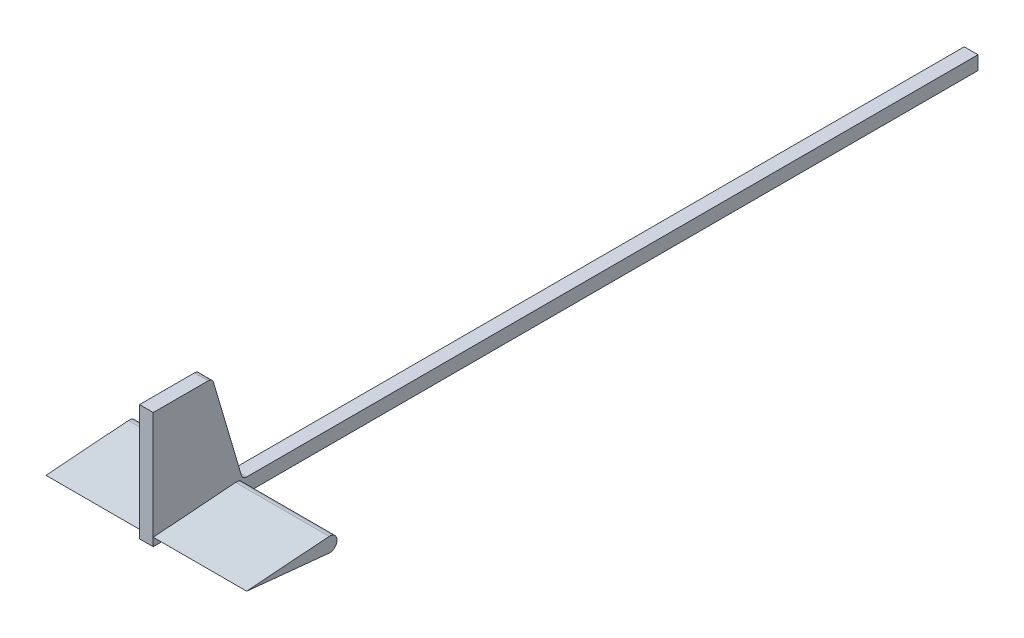
ISO-10303-21;
HEADER;
FILE_DESCRIPTION(('STEP AP214'),'2;1');
FILE_NAME('part.step','',(''),(''),'','','');
FILE_SCHEMA(('AUTOMOTIVE_DESIGN { 1 0 10303 214 1 1 1 1 }'));
ENDSEC;
DATA;
#1=APPLICATION_CONTEXT('core data for automotive mechanical design processes');
#2=APPLICATION_PROTOCOL_DEFINITION('international standard','automotive_design',2000,#1);
#3=PRODUCT_CONTEXT('',#1,'mechanical');
#4=PRODUCT('Part','Part','',(#3));
#5=PRODUCT_RELATED_PRODUCT_CATEGORY('part','',(#4));
#6=PRODUCT_DEFINITION_FORMATION('','',#4);
#7=PRODUCT_DEFINITION_CONTEXT('part definition',#1,'design');
#8=PRODUCT_DEFINITION('design','',#6,#7);
#9=PRODUCT_DEFINITION_SHAPE('','',#8);
#10=(LENGTH_UNIT() NAMED_UNIT(*) SI_UNIT(.MILLI.,.METRE.));
#11=(NAMED_UNIT(*) PLANE_ANGLE_UNIT() SI_UNIT($,.RADIAN.));
#12=(NAMED_UNIT(*) SI_UNIT($,.STERADIAN.) SOLID_ANGLE_UNIT());
#13=UNCERTAINTY_MEASURE_WITH_UNIT(LENGTH_MEASURE(1.E-05),#10,'distance_accuracy_value','');
#14=(GEOMETRIC_REPRESENTATION_CONTEXT(3) GLOBAL_UNCERTAINTY_ASSIGNED_CONTEXT((#13)) GLOBAL_UNIT_ASSIGNED_CONTEXT((#10,
#11,#12)) REPRESENTATION_CONTEXT('',''));
#15=CARTESIAN_POINT('',(0.,0.,0.));
#16=DIRECTION('',(0.,0.,1.));
#17=DIRECTION('',(1.,0.,0.));
#18=AXIS2_PLACEMENT_3D('',#15,#16,#17);
#19=CARTESIAN_POINT('',(0.,0.,150.));
#20=DIRECTION('',(1.,0.,0.));
#21=DIRECTION('',(0.,0.,-1.));
#22=AXIS2_PLACEMENT_3D('',#19,#20,#21);
#23=PLANE('',#22);
#24=DIRECTION('',(0.,-1.,0.));
#25=VECTOR('',#24,1.);
#26=CARTESIAN_POINT('',(0.,0.,150.));
#27=LINE('',#26,#25);
#28=CARTESIAN_POINT('',(0.,1.5,150.));
#29=VERTEX_POINT('',#28);
#30=CARTESIAN_POINT('',(0.,0.,150.));
#31=VERTEX_POINT('',#30);
#32=EDGE_CURVE('E347',#29,#31,#27,.T.);
#33=ORIENTED_EDGE('',*,*,#32,.F.);
#34=DIRECTION('',(0.,-0.099503719020999,-0.995037190209989));
#35=VECTOR('',#34,1.);
#36=CARTESIAN_POINT('',(0.,0.,135.));
#37=LINE('',#36,#35);
#38=CARTESIAN_POINT('',(0.,0.,135.));
#39=VERTEX_POINT('',#38);
#40=EDGE_CURVE('E55',#29,#39,#37,.T.);
#41=ORIENTED_EDGE('',*,*,#40,.T.);
#42=DIRECTION('',(0.,0.,-1.));
#43=VECTOR('',#42,1.);
#44=CARTESIAN_POINT('',(0.,0.,150.));
#45=LINE('',#44,#43);
#46=EDGE_CURVE('E189',#31,#39,#45,.T.);
#47=ORIENTED_EDGE('',*,*,#46,.F.);
#48=EDGE_LOOP('',(#33,#41,#47));
#49=FACE_BOUND('',#48,.T.);
#50=ADVANCED_FACE('F38',(#49),#23,.F.);
#51=CARTESIAN_POINT('',(2.5,0.,150.));
#52=DIRECTION('',(-1.,0.,0.));
#53=DIRECTION('',(0.,0.,1.));
#54=AXIS2_PLACEMENT_3D('',#51,#52,#53);
#55=PLANE('',#54);
#56=DIRECTION('',(0.,-0.099503719020999,-0.995037190209989));
#57=VECTOR('',#56,1.);
#58=CARTESIAN_POINT('',(2.5,0.,135.));
#59=LINE('',#58,#57);
#60=CARTESIAN_POINT('',(2.5,1.5,150.));
#61=VERTEX_POINT('',#60);
#62=CARTESIAN_POINT('',(2.5,0.,135.));
#63=VERTEX_POINT('',#62);
#64=EDGE_CURVE('E153',#61,#63,#59,.T.);
#65=ORIENTED_EDGE('',*,*,#64,.F.);
#66=DIRECTION('',(0.,1.,0.));
#67=VECTOR('',#66,1.);
#68=CARTESIAN_POINT('',(2.5,0.,150.));
#69=LINE('',#68,#67);
#70=CARTESIAN_POINT('',(2.5,0.,150.));
#71=VERTEX_POINT('',#70);
#72=EDGE_CURVE('E364',#71,#61,#69,.T.);
#73=ORIENTED_EDGE('',*,*,#72,.F.);
#74=DIRECTION('',(0.,0.,-1.));
#75=VECTOR('',#74,1.);
#76=CARTESIAN_POINT('',(2.5,0.,150.));
#77=LINE('',#76,#75);
#78=EDGE_CURVE('E277',#71,#63,#77,.T.);
#79=ORIENTED_EDGE('',*,*,#78,.T.);
#80=EDGE_LOOP('',(#65,#73,#79));
#81=FACE_BOUND('',#80,.T.);
#82=ADVANCED_FACE('F265',(#81),#55,.F.);
#83=CARTESIAN_POINT('',(0.,2.5,150.));
#84=DIRECTION('',(0.,-1.,0.));
#85=DIRECTION('',(0.,0.,-1.));
#86=AXIS2_PLACEMENT_3D('',#83,#84,#85);
#87=PLANE('',#86);
#88=DIRECTION('',(1.,0.,0.));
#89=VECTOR('',#88,1.);
#90=CARTESIAN_POINT('',(0.,2.49999999999999,133.));
#91=LINE('',#90,#89);
#92=CARTESIAN_POINT('',(0.,2.49999999999999,133.));
#93=VERTEX_POINT('',#92);
#94=CARTESIAN_POINT('',(2.5,2.49999999999999,133.));
#95=VERTEX_POINT('',#94);
#96=EDGE_CURVE('E361',#93,#95,#91,.T.);
#97=ORIENTED_EDGE('',*,*,#96,.T.);
#98=DIRECTION('',(0.,0.,-1.));
#99=VECTOR('',#98,1.);
#100=CARTESIAN_POINT('',(2.5,2.5,150.));
#101=LINE('',#100,#99);
#102=CARTESIAN_POINT('',(2.5,2.5,0.));
#103=VERTEX_POINT('',#102);
#104=EDGE_CURVE('E376',#95,#103,#101,.T.);
#105=ORIENTED_EDGE('',*,*,#104,.T.);
#106=DIRECTION('',(-1.,0.,0.));
#107=VECTOR('',#106,1.);
#108=CARTESIAN_POINT('',(0.,2.5,0.));
#109=LINE('',#108,#107);
#110=CARTESIAN_POINT('',(0.,2.5,0.));
#111=VERTEX_POINT('',#110);
#112=EDGE_CURVE('E350',#103,#111,#109,.T.);
#113=ORIENTED_EDGE('',*,*,#112,.T.);
#114=DIRECTION('',(0.,0.,-1.));
#115=VECTOR('',#114,1.);
#116=CARTESIAN_POINT('',(0.,2.5,150.));
#117=LINE('',#116,#115);
#118=EDGE_CURVE('E367',#93,#111,#117,.T.);
#119=ORIENTED_EDGE('',*,*,#118,.F.);
#120=EDGE_LOOP('',(#97,#105,#113,#119));
#121=FACE_BOUND('',#120,.T.);
#122=ADVANCED_FACE('F262',(#121),#87,.F.);
#123=CARTESIAN_POINT('',(0.,0.,134.797861482793));
#124=VERTEX_POINT('',#123);
#125=CARTESIAN_POINT('',(0.,0.,0.));
#126=VERTEX_POINT('',#125);
#127=EDGE_CURVE('E42',#124,#126,#45,.T.);
#128=ORIENTED_EDGE('',*,*,#127,.F.);
#129=CARTESIAN_POINT('',(0.,1.3229685857271,134.898930741397));
#130=DIRECTION('',(1.,0.,0.));
#131=DIRECTION('',(0.,0.,1.));
#132=AXIS2_PLACEMENT_3D('',#129,#130,#131);
#133=CIRCLE('',#132,1.32682360314226);
#134=CARTESIAN_POINT('',(0.,2.64593717145421,135.));
#135=VERTEX_POINT('',#134);
#136=EDGE_CURVE('E11',#124,#135,#133,.T.);
#137=ORIENTED_EDGE('',*,*,#136,.T.);
#138=DIRECTION('',(0.,-0.0761738473479329,0.997094551675123));
#139=VECTOR('',#138,1.);
#140=CARTESIAN_POINT('',(0.,1.5,150.));
#141=LINE('',#140,#139);
#142=EDGE_CURVE('E162',#135,#29,#141,.T.);
#143=ORIENTED_EDGE('',*,*,#142,.T.);
#144=CARTESIAN_POINT('',(0.,21.1421400013606,150.));
#145=VERTEX_POINT('',#144);
#146=EDGE_CURVE('E349',#145,#29,#27,.T.);
#147=ORIENTED_EDGE('',*,*,#146,.F.);
#148=DIRECTION('',(0.,0.,1.));
#149=VECTOR('',#148,1.);
#150=CARTESIAN_POINT('',(0.,21.1421400013606,150.));
#151=LINE('',#150,#149);
#152=CARTESIAN_POINT('',(0.,21.1421400013606,140.));
#153=VERTEX_POINT('',#152);
#154=EDGE_CURVE('E406',#153,#145,#151,.T.);
#155=ORIENTED_EDGE('',*,*,#154,.F.);
#156=CARTESIAN_POINT('',(0.,20.1421400013606,140.));
#157=DIRECTION('',(1.,0.,0.));
#158=DIRECTION('',(0.,0.,1.));
#159=AXIS2_PLACEMENT_3D('',#156,#157,#158);
#160=CIRCLE('',#159,0.999999999999983);
#161=CARTESIAN_POINT('',(0.,20.4253598882966,139.040944998635));
#162=VERTEX_POINT('',#161);
#163=EDGE_CURVE('E389',#162,#153,#160,.T.);
#164=ORIENTED_EDGE('',*,*,#163,.F.);
#165=DIRECTION('',(0.,0.959055001365397,0.28321988693596));
#166=VECTOR('',#165,1.);
#167=CARTESIAN_POINT('',(0.,20.4253598882966,139.040944998635));
#168=LINE('',#167,#166);
#169=CARTESIAN_POINT('',(0.,3.21678011306403,133.959055001365));
#170=VERTEX_POINT('',#169);
#171=EDGE_CURVE('E387',#170,#162,#168,.T.);
#172=ORIENTED_EDGE('',*,*,#171,.F.);
#173=CARTESIAN_POINT('',(0.,3.5,133.));
#174=DIRECTION('',(-1.,0.,0.));
#175=DIRECTION('',(0.,0.,-1.));
#176=AXIS2_PLACEMENT_3D('',#173,#174,#175);
#177=CIRCLE('',#176,1.00000000000001);
#178=EDGE_CURVE('E219',#93,#170,#177,.T.);
#179=ORIENTED_EDGE('',*,*,#178,.F.);
#180=ORIENTED_EDGE('',*,*,#118,.T.);
#181=DIRECTION('',(0.,-1.,0.));
#182=VECTOR('',#181,1.);
#183=CARTESIAN_POINT('',(0.,0.,0.));
#184=LINE('',#183,#182);
#185=EDGE_CURVE('E342',#111,#126,#184,.T.);
#186=ORIENTED_EDGE('',*,*,#185,.T.);
#187=EDGE_LOOP('',(#128,#137,#143,#147,#155,#164,#172,#179,#180,#186));
#188=FACE_BOUND('',#187,.T.);
#189=ADVANCED_FACE('F40',(#188),#23,.F.);
#190=CARTESIAN_POINT('',(0.,0.,150.));
#191=DIRECTION('',(0.,1.,0.));
#192=DIRECTION('',(0.,0.,1.));
#193=AXIS2_PLACEMENT_3D('',#190,#191,#192);
#194=PLANE('',#193);
#195=DIRECTION('',(1.,0.,0.));
#196=VECTOR('',#195,1.);
#197=CARTESIAN_POINT('',(0.,0.,0.));
#198=LINE('',#197,#196);
#199=CARTESIAN_POINT('',(2.5,0.,0.));
#200=VERTEX_POINT('',#199);
#201=EDGE_CURVE('E369',#126,#200,#198,.T.);
#202=ORIENTED_EDGE('',*,*,#201,.T.);
#203=CARTESIAN_POINT('',(2.5,0.,134.797861482793));
#204=VERTEX_POINT('',#203);
#205=EDGE_CURVE('E181',#204,#200,#77,.T.);
#206=ORIENTED_EDGE('',*,*,#205,.F.);
#207=CARTESIAN_POINT('',(2.5,1.3229685857271,134.898930741397));
#208=DIRECTION('',(1.,0.,0.));
#209=DIRECTION('',(0.,-0.997094551675122,0.0761738473479366));
#210=AXIS2_PLACEMENT_3D('',#207,#208,#209);
#211=CIRCLE('',#210,1.32682360314226);
#212=EDGE_CURVE('E214',#63,#204,#211,.T.);
#213=ORIENTED_EDGE('',*,*,#212,.F.);
#214=ORIENTED_EDGE('',*,*,#78,.F.);
#215=DIRECTION('',(1.,0.,0.));
#216=VECTOR('',#215,1.);
#217=CARTESIAN_POINT('',(0.,0.,150.));
#218=LINE('',#217,#216);
#219=EDGE_CURVE('E357',#31,#71,#218,.T.);
#220=ORIENTED_EDGE('',*,*,#219,.F.);
#221=ORIENTED_EDGE('',*,*,#46,.T.);
#222=CARTESIAN_POINT('',(0.,0.,135.));
#223=DIRECTION('',(0.,0.,-1.));
#224=VECTOR('',#223,1.);
#225=LINE('',#222,#224);
#226=EDGE_CURVE('E191',#39,#124,#225,.T.);
#227=ORIENTED_EDGE('',*,*,#226,.T.);
#228=ORIENTED_EDGE('',*,*,#127,.T.);
#229=EDGE_LOOP('',(#202,#206,#213,#214,#220,#221,#227,#228));
#230=FACE_BOUND('',#229,.T.);
#231=ADVANCED_FACE('F268',(#230),#194,.F.);
#232=DIRECTION('',(0.,-0.0761738473479329,0.997094551675123));
#233=VECTOR('',#232,1.);
#234=CARTESIAN_POINT('',(2.5,1.5,150.));
#235=LINE('',#234,#233);
#236=CARTESIAN_POINT('',(2.5,2.64593717145421,135.));
#237=VERTEX_POINT('',#236);
#238=EDGE_CURVE('E207',#237,#61,#235,.T.);
#239=ORIENTED_EDGE('',*,*,#238,.F.);
#240=CARTESIAN_POINT('',(2.5,1.3229685857271,134.898930741397));
#241=DIRECTION('',(1.,0.,0.));
#242=DIRECTION('',(0.,0.,1.));
#243=AXIS2_PLACEMENT_3D('',#240,#241,#242);
#244=CIRCLE('',#243,1.32682360314226);
#245=EDGE_CURVE('E48',#204,#237,#244,.T.);
#246=ORIENTED_EDGE('',*,*,#245,.F.);
#247=ORIENTED_EDGE('',*,*,#205,.T.);
#248=DIRECTION('',(0.,1.,0.));
#249=VECTOR('',#248,1.);
#250=CARTESIAN_POINT('',(2.5,0.,0.));
#251=LINE('',#250,#249);
#252=EDGE_CURVE('E371',#200,#103,#251,.T.);
#253=ORIENTED_EDGE('',*,*,#252,.T.);
#254=ORIENTED_EDGE('',*,*,#104,.F.);
#255=CARTESIAN_POINT('',(2.5,3.5,133.));
#256=DIRECTION('',(-1.,0.,0.));
#257=DIRECTION('',(0.,0.,-1.));
#258=AXIS2_PLACEMENT_3D('',#255,#256,#257);
#259=CIRCLE('',#258,1.00000000000001);
#260=CARTESIAN_POINT('',(2.5,3.21678011306403,133.959055001365));
#261=VERTEX_POINT('',#260);
#262=EDGE_CURVE('E296',#95,#261,#259,.T.);
#263=ORIENTED_EDGE('',*,*,#262,.T.);
#264=DIRECTION('',(0.,0.959055001365397,0.28321988693596));
#265=VECTOR('',#264,1.);
#266=CARTESIAN_POINT('',(2.5,20.4253598882966,139.040944998635));
#267=LINE('',#266,#265);
#268=CARTESIAN_POINT('',(2.5,20.4253598882966,139.040944998635));
#269=VERTEX_POINT('',#268);
#270=EDGE_CURVE('E396',#261,#269,#267,.T.);
#271=ORIENTED_EDGE('',*,*,#270,.T.);
#272=CARTESIAN_POINT('',(2.5,20.1421400013606,140.));
#273=DIRECTION('',(1.,0.,0.));
#274=DIRECTION('',(0.,0.,1.));
#275=AXIS2_PLACEMENT_3D('',#272,#273,#274);
#276=CIRCLE('',#275,0.999999999999983);
#277=CARTESIAN_POINT('',(2.5,21.1421400013606,140.));
#278=VERTEX_POINT('',#277);
#279=EDGE_CURVE('E391',#269,#278,#276,.T.);
#280=ORIENTED_EDGE('',*,*,#279,.T.);
#281=DIRECTION('',(0.,0.,1.));
#282=VECTOR('',#281,1.);
#283=CARTESIAN_POINT('',(2.5,21.1421400013606,150.));
#284=LINE('',#283,#282);
#285=CARTESIAN_POINT('',(2.5,21.1421400013606,150.));
#286=VERTEX_POINT('',#285);
#287=EDGE_CURVE('E388',#278,#286,#284,.T.);
#288=ORIENTED_EDGE('',*,*,#287,.T.);
#289=EDGE_CURVE('E358',#61,#286,#69,.T.);
#290=ORIENTED_EDGE('',*,*,#289,.F.);
#291=EDGE_LOOP('',(#239,#246,#247,#253,#254,#263,#271,#280,#288,#290));
#292=FACE_BOUND('',#291,.T.);
#293=ADVANCED_FACE('F257',(#292),#55,.F.);
#294=CARTESIAN_POINT('',(0.,0.,150.));
#295=DIRECTION('',(0.,0.,-1.));
#296=DIRECTION('',(-1.,0.,0.));
#297=AXIS2_PLACEMENT_3D('',#294,#295,#296);
#298=PLANE('',#297);
#299=ORIENTED_EDGE('',*,*,#146,.T.);
#300=ORIENTED_EDGE('',*,*,#32,.T.);
#301=ORIENTED_EDGE('',*,*,#219,.T.);
#302=ORIENTED_EDGE('',*,*,#72,.T.);
#303=ORIENTED_EDGE('',*,*,#289,.T.);
#304=DIRECTION('',(1.,0.,0.));
#305=VECTOR('',#304,1.);
#306=CARTESIAN_POINT('',(0.,21.1421400013606,150.));
#307=LINE('',#306,#305);
#308=EDGE_CURVE('E354',#145,#286,#307,.T.);
#309=ORIENTED_EDGE('',*,*,#308,.F.);
#310=EDGE_LOOP('',(#299,#300,#301,#302,#303,#309));
#311=FACE_BOUND('',#310,.T.);
#312=ADVANCED_FACE('F254',(#311),#298,.F.);
#313=CARTESIAN_POINT('',(0.,0.,0.));
#314=DIRECTION('',(0.,0.,-1.));
#315=DIRECTION('',(-1.,0.,0.));
#316=AXIS2_PLACEMENT_3D('',#313,#314,#315);
#317=PLANE('',#316);
#318=ORIENTED_EDGE('',*,*,#185,.F.);
#319=ORIENTED_EDGE('',*,*,#112,.F.);
#320=ORIENTED_EDGE('',*,*,#252,.F.);
#321=ORIENTED_EDGE('',*,*,#201,.F.);
#322=EDGE_LOOP('',(#318,#319,#320,#321));
#323=FACE_BOUND('',#322,.T.);
#324=ADVANCED_FACE('F242',(#323),#317,.T.);
#325=CARTESIAN_POINT('',(0.,21.1421400013606,150.));
#326=DIRECTION('',(0.,1.,0.));
#327=DIRECTION('',(0.,0.,1.));
#328=AXIS2_PLACEMENT_3D('',#325,#326,#327);
#329=PLANE('',#328);
#330=ORIENTED_EDGE('',*,*,#287,.F.);
#331=DIRECTION('',(1.,0.,0.));
#332=VECTOR('',#331,1.);
#333=CARTESIAN_POINT('',(0.,21.1421400013606,140.));
#334=LINE('',#333,#332);
#335=EDGE_CURVE('E401',#153,#278,#334,.T.);
#336=ORIENTED_EDGE('',*,*,#335,.F.);
#337=ORIENTED_EDGE('',*,*,#154,.T.);
#338=ORIENTED_EDGE('',*,*,#308,.T.);
#339=EDGE_LOOP('',(#330,#336,#337,#338));
#340=FACE_BOUND('',#339,.T.);
#341=ADVANCED_FACE('F238',(#340),#329,.T.);
#342=CARTESIAN_POINT('',(0.,20.1421400013606,140.));
#343=DIRECTION('',(1.,0.,0.));
#344=DIRECTION('',(0.,0.,-1.));
#345=AXIS2_PLACEMENT_3D('',#342,#343,#344);
#346=CYLINDRICAL_SURFACE('',#345,0.999999999999983);
#347=ORIENTED_EDGE('',*,*,#279,.F.);
#348=DIRECTION('',(1.,0.,0.));
#349=VECTOR('',#348,1.);
#350=CARTESIAN_POINT('',(0.,20.4253598882966,139.040944998635));
#351=LINE('',#350,#349);
#352=EDGE_CURVE('E403',#162,#269,#351,.T.);
#353=ORIENTED_EDGE('',*,*,#352,.F.);
#354=ORIENTED_EDGE('',*,*,#163,.T.);
#355=ORIENTED_EDGE('',*,*,#335,.T.);
#356=EDGE_LOOP('',(#347,#353,#354,#355));
#357=FACE_BOUND('',#356,.T.);
#358=ADVANCED_FACE('F241',(#357),#346,.T.);
#359=CARTESIAN_POINT('',(0.,20.4253598882966,139.040944998635));
#360=DIRECTION('',(0.,0.28321988693596,-0.959055001365397));
#361=DIRECTION('',(0.,0.959055001365397,0.28321988693596));
#362=AXIS2_PLACEMENT_3D('',#359,#360,#361);
#363=PLANE('',#362);
#364=ORIENTED_EDGE('',*,*,#270,.F.);
#365=DIRECTION('',(1.,0.,0.));
#366=VECTOR('',#365,1.);
#367=CARTESIAN_POINT('',(0.,3.21678011306403,133.959055001365));
#368=LINE('',#367,#366);
#369=EDGE_CURVE('E404',#170,#261,#368,.T.);
#370=ORIENTED_EDGE('',*,*,#369,.F.);
#371=ORIENTED_EDGE('',*,*,#171,.T.);
#372=ORIENTED_EDGE('',*,*,#352,.T.);
#373=EDGE_LOOP('',(#364,#370,#371,#372));
#374=FACE_BOUND('',#373,.T.);
#375=ADVANCED_FACE('F246',(#374),#363,.T.);
#376=CARTESIAN_POINT('',(0.,3.5,133.));
#377=DIRECTION('',(1.,0.,0.));
#378=DIRECTION('',(0.,0.,-1.));
#379=AXIS2_PLACEMENT_3D('',#376,#377,#378);
#380=CYLINDRICAL_SURFACE('',#379,1.00000000000001);
#381=ORIENTED_EDGE('',*,*,#262,.F.);
#382=ORIENTED_EDGE('',*,*,#96,.F.);
#383=ORIENTED_EDGE('',*,*,#178,.T.);
#384=ORIENTED_EDGE('',*,*,#369,.T.);
#385=EDGE_LOOP('',(#381,#382,#383,#384));
#386=FACE_BOUND('',#385,.T.);
#387=ADVANCED_FACE('F236',(#386),#380,.F.);
#388=CARTESIAN_POINT('',(19.5,0.,135.));
#389=DIRECTION('',(0.,0.995037190209989,-0.099503719020999));
#390=DIRECTION('',(0.,0.099503719020999,0.995037190209989));
#391=AXIS2_PLACEMENT_3D('',#388,#389,#390);
#392=PLANE('',#391);
#393=ORIENTED_EDGE('',*,*,#64,.T.);
#394=DIRECTION('',(-1.,0.,0.));
#395=VECTOR('',#394,1.);
#396=CARTESIAN_POINT('',(19.5,0.,135.));
#397=LINE('',#396,#395);
#398=CARTESIAN_POINT('',(19.5,0.,135.));
#399=VERTEX_POINT('',#398);
#400=EDGE_CURVE('E293',#399,#63,#397,.T.);
#401=ORIENTED_EDGE('',*,*,#400,.F.);
#402=DIRECTION('',(0.,-0.099503719020999,-0.995037190209989));
#403=VECTOR('',#402,1.);
#404=CARTESIAN_POINT('',(19.5,0.,135.));
#405=LINE('',#404,#403);
#406=CARTESIAN_POINT('',(19.5,1.5,150.));
#407=VERTEX_POINT('',#406);
#408=EDGE_CURVE('E300',#407,#399,#405,.T.);
#409=ORIENTED_EDGE('',*,*,#408,.F.);
#410=DIRECTION('',(-1.,0.,0.));
#411=VECTOR('',#410,1.);
#412=CARTESIAN_POINT('',(19.5,1.5,150.));
#413=LINE('',#412,#411);
#414=EDGE_CURVE('E294',#407,#61,#413,.T.);
#415=ORIENTED_EDGE('',*,*,#414,.T.);
#416=EDGE_LOOP('',(#393,#401,#409,#415));
#417=FACE_BOUND('',#416,.T.);
#418=ADVANCED_FACE('F232',(#417),#392,.F.);
#419=CARTESIAN_POINT('',(19.5,1.3229685857271,134.898930741397));
#420=DIRECTION('',(-1.,0.,0.));
#421=DIRECTION('',(0.,0.,1.));
#422=AXIS2_PLACEMENT_3D('',#419,#420,#421);
#423=CYLINDRICAL_SURFACE('',#422,1.32682360314226);
#424=ORIENTED_EDGE('',*,*,#212,.T.);
#425=ORIENTED_EDGE('',*,*,#245,.T.);
#426=DIRECTION('',(-1.,0.,0.));
#427=VECTOR('',#426,1.);
#428=CARTESIAN_POINT('',(19.5,2.64593717145421,135.));
#429=LINE('',#428,#427);
#430=CARTESIAN_POINT('',(19.5,2.64593717145421,135.));
#431=VERTEX_POINT('',#430);
#432=EDGE_CURVE('E286',#431,#237,#429,.T.);
#433=ORIENTED_EDGE('',*,*,#432,.F.);
#434=CARTESIAN_POINT('',(19.5,1.3229685857271,134.898930741397));
#435=DIRECTION('',(1.,0.,0.));
#436=DIRECTION('',(0.,0.,1.));
#437=AXIS2_PLACEMENT_3D('',#434,#435,#436);
#438=CIRCLE('',#437,1.32682360314226);
#439=EDGE_CURVE('E302',#399,#431,#438,.T.);
#440=ORIENTED_EDGE('',*,*,#439,.F.);
#441=ORIENTED_EDGE('',*,*,#400,.T.);
#442=EDGE_LOOP('',(#424,#425,#433,#440,#441));
#443=FACE_BOUND('',#442,.T.);
#444=ADVANCED_FACE('F221',(#443),#423,.T.);
#445=CARTESIAN_POINT('',(19.5,1.5,150.));
#446=DIRECTION('',(0.,-0.997094551675123,-0.0761738473479329));
#447=DIRECTION('',(0.,0.0761738473479329,-0.997094551675123));
#448=AXIS2_PLACEMENT_3D('',#445,#446,#447);
#449=PLANE('',#448);
#450=ORIENTED_EDGE('',*,*,#238,.T.);
#451=ORIENTED_EDGE('',*,*,#414,.F.);
#452=DIRECTION('',(0.,-0.0761738473479329,0.997094551675123));
#453=VECTOR('',#452,1.);
#454=CARTESIAN_POINT('',(19.5,1.5,150.));
#455=LINE('',#454,#453);
#456=EDGE_CURVE('E292',#431,#407,#455,.T.);
#457=ORIENTED_EDGE('',*,*,#456,.F.);
#458=ORIENTED_EDGE('',*,*,#432,.T.);
#459=EDGE_LOOP('',(#450,#451,#457,#458));
#460=FACE_BOUND('',#459,.T.);
#461=ADVANCED_FACE('F231',(#460),#449,.F.);
#462=CARTESIAN_POINT('',(19.5,1.3229685857271,134.898930741397));
#463=DIRECTION('',(-1.,0.,0.));
#464=DIRECTION('',(0.,0.,1.));
#465=AXIS2_PLACEMENT_3D('',#462,#463,#464);
#466=PLANE('',#465);
#467=ORIENTED_EDGE('',*,*,#408,.T.);
#468=ORIENTED_EDGE('',*,*,#439,.T.);
#469=ORIENTED_EDGE('',*,*,#456,.T.);
#470=EDGE_LOOP('',(#467,#468,#469));
#471=FACE_BOUND('',#470,.T.);
#472=ADVANCED_FACE('F322',(#471),#466,.F.);
#473=CARTESIAN_POINT('',(-17.,0.,135.));
#474=DIRECTION('',(0.,-0.995037190209989,0.099503719020999));
#475=DIRECTION('',(0.,-0.099503719020999,-0.995037190209989));
#476=AXIS2_PLACEMENT_3D('',#473,#474,#475);
#477=PLANE('',#476);
#478=ORIENTED_EDGE('',*,*,#40,.F.);
#479=DIRECTION('',(1.,0.,0.));
#480=VECTOR('',#479,1.);
#481=CARTESIAN_POINT('',(-17.,1.5,150.));
#482=LINE('',#481,#480);
#483=CARTESIAN_POINT('',(-17.,1.5,150.));
#484=VERTEX_POINT('',#483);
#485=EDGE_CURVE('E144',#484,#29,#482,.T.);
#486=ORIENTED_EDGE('',*,*,#485,.F.);
#487=DIRECTION('',(0.,-0.099503719020999,-0.995037190209989));
#488=VECTOR('',#487,1.);
#489=CARTESIAN_POINT('',(-17.,0.,135.));
#490=LINE('',#489,#488);
#491=CARTESIAN_POINT('',(-17.,0.,135.));
#492=VERTEX_POINT('',#491);
#493=EDGE_CURVE('E147',#484,#492,#490,.T.);
#494=ORIENTED_EDGE('',*,*,#493,.T.);
#495=DIRECTION('',(1.,0.,0.));
#496=VECTOR('',#495,1.);
#497=CARTESIAN_POINT('',(-17.,0.,135.));
#498=LINE('',#497,#496);
#499=EDGE_CURVE('E166',#492,#39,#498,.T.);
#500=ORIENTED_EDGE('',*,*,#499,.T.);
#501=EDGE_LOOP('',(#478,#486,#494,#500));
#502=FACE_BOUND('',#501,.T.);
#503=ADVANCED_FACE('F146',(#502),#477,.T.);
#504=CARTESIAN_POINT('',(-17.,1.5,150.));
#505=DIRECTION('',(0.,0.997094551675123,0.0761738473479329));
#506=DIRECTION('',(0.,-0.0761738473479329,0.997094551675123));
#507=AXIS2_PLACEMENT_3D('',#504,#505,#506);
#508=PLANE('',#507);
#509=ORIENTED_EDGE('',*,*,#142,.F.);
#510=DIRECTION('',(1.,0.,0.));
#511=VECTOR('',#510,1.);
#512=CARTESIAN_POINT('',(-17.,2.64593717145421,135.));
#513=LINE('',#512,#511);
#514=CARTESIAN_POINT('',(-17.,2.64593717145421,135.));
#515=VERTEX_POINT('',#514);
#516=EDGE_CURVE('E154',#515,#135,#513,.T.);
#517=ORIENTED_EDGE('',*,*,#516,.F.);
#518=DIRECTION('',(0.,-0.0761738473479329,0.997094551675123));
#519=VECTOR('',#518,1.);
#520=CARTESIAN_POINT('',(-17.,1.5,150.));
#521=LINE('',#520,#519);
#522=EDGE_CURVE('E159',#515,#484,#521,.T.);
#523=ORIENTED_EDGE('',*,*,#522,.T.);
#524=ORIENTED_EDGE('',*,*,#485,.T.);
#525=EDGE_LOOP('',(#509,#517,#523,#524));
#526=FACE_BOUND('',#525,.T.);
#527=ADVANCED_FACE('F164',(#526),#508,.T.);
#528=CARTESIAN_POINT('',(-17.,1.3229685857271,134.898930741397));
#529=DIRECTION('',(1.,0.,0.));
#530=DIRECTION('',(0.,0.,-1.));
#531=AXIS2_PLACEMENT_3D('',#528,#529,#530);
#532=CYLINDRICAL_SURFACE('',#531,1.32682360314226);
#533=ORIENTED_EDGE('',*,*,#226,.F.);
#534=ORIENTED_EDGE('',*,*,#499,.F.);
#535=CARTESIAN_POINT('',(-17.,1.3229685857271,134.898930741397));
#536=DIRECTION('',(1.,0.,0.));
#537=DIRECTION('',(0.,0.,1.));
#538=AXIS2_PLACEMENT_3D('',#535,#536,#537);
#539=CIRCLE('',#538,1.32682360314226);
#540=EDGE_CURVE('E161',#492,#515,#539,.T.);
#541=ORIENTED_EDGE('',*,*,#540,.T.);
#542=ORIENTED_EDGE('',*,*,#516,.T.);
#543=ORIENTED_EDGE('',*,*,#136,.F.);
#544=EDGE_LOOP('',(#533,#534,#541,#542,#543));
#545=FACE_BOUND('',#544,.T.);
#546=ADVANCED_FACE('F308',(#545),#532,.T.);
#547=CARTESIAN_POINT('',(-17.,1.3229685857271,134.898930741397));
#548=DIRECTION('',(1.,0.,0.));
#549=DIRECTION('',(0.,0.,1.));
#550=AXIS2_PLACEMENT_3D('',#547,#548,#549);
#551=PLANE('',#550);
#552=ORIENTED_EDGE('',*,*,#493,.F.);
#553=ORIENTED_EDGE('',*,*,#522,.F.);
#554=ORIENTED_EDGE('',*,*,#540,.F.);
#555=EDGE_LOOP('',(#552,#553,#554));
#556=FACE_BOUND('',#555,.T.);
#557=ADVANCED_FACE('F158',(#556),#551,.F.);
#558=CLOSED_SHELL('',(#50,#82,#122,#189,#231,#293,#312,#324,#341,#358,#375,#387,#418,#444,#461,
#472,#503,#527,#546,#557));
#559=MANIFOLD_SOLID_BREP('B2',#558);
#560=ADVANCED_BREP_SHAPE_REPRESENTATION('',(#18,#559),#14);
#561=SHAPE_DEFINITION_REPRESENTATION(#9,#560);
ENDSEC;
END-ISO-10303-21;
